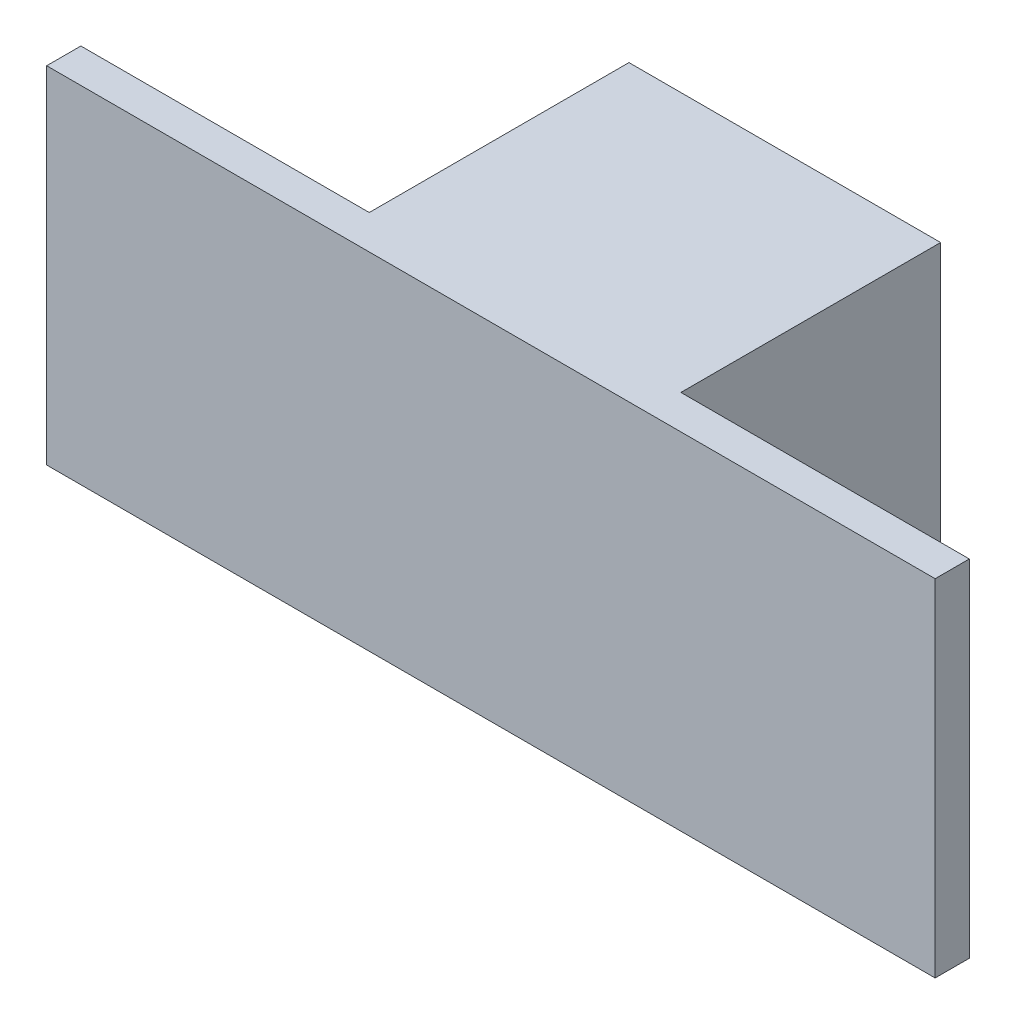
ISO-10303-21;
HEADER;
FILE_DESCRIPTION(('STEP AP214'),'2;1');
FILE_NAME('part.step','',(''),(''),'','','');
FILE_SCHEMA(('AUTOMOTIVE_DESIGN { 1 0 10303 214 1 1 1 1 }'));
ENDSEC;
DATA;
#1=APPLICATION_CONTEXT('core data for automotive mechanical design processes');
#2=APPLICATION_PROTOCOL_DEFINITION('international standard','automotive_design',2000,#1);
#3=PRODUCT_CONTEXT('',#1,'mechanical');
#4=PRODUCT('Part','Part','',(#3));
#5=PRODUCT_RELATED_PRODUCT_CATEGORY('part','',(#4));
#6=PRODUCT_DEFINITION_FORMATION('','',#4);
#7=PRODUCT_DEFINITION_CONTEXT('part definition',#1,'design');
#8=PRODUCT_DEFINITION('design','',#6,#7);
#9=PRODUCT_DEFINITION_SHAPE('','',#8);
#10=(LENGTH_UNIT() NAMED_UNIT(*) SI_UNIT(.MILLI.,.METRE.));
#11=(NAMED_UNIT(*) PLANE_ANGLE_UNIT() SI_UNIT($,.RADIAN.));
#12=(NAMED_UNIT(*) SI_UNIT($,.STERADIAN.) SOLID_ANGLE_UNIT());
#13=UNCERTAINTY_MEASURE_WITH_UNIT(LENGTH_MEASURE(1.E-05),#10,'distance_accuracy_value','');
#14=(GEOMETRIC_REPRESENTATION_CONTEXT(3) GLOBAL_UNCERTAINTY_ASSIGNED_CONTEXT((#13)) GLOBAL_UNIT_ASSIGNED_CONTEXT((#10,
#11,#12)) REPRESENTATION_CONTEXT('',''));
#15=CARTESIAN_POINT('',(0.,0.,0.));
#16=DIRECTION('',(0.,0.,1.));
#17=DIRECTION('',(1.,0.,0.));
#18=AXIS2_PLACEMENT_3D('',#15,#16,#17);
#19=CARTESIAN_POINT('',(2.25036858686379E-13,0.,-5.));
#20=DIRECTION('',(0.,0.,1.));
#21=DIRECTION('',(1.,0.,0.));
#22=AXIS2_PLACEMENT_3D('',#19,#20,#21);
#23=PLANE('',#22);
#24=DIRECTION('',(0.,-1.,0.));
#25=VECTOR('',#24,1.);
#26=CARTESIAN_POINT('',(22.8000000000002,12.,-5.));
#27=LINE('',#26,#25);
#28=CARTESIAN_POINT('',(22.8000000000002,12.,-5.));
#29=VERTEX_POINT('',#28);
#30=CARTESIAN_POINT('',(22.8000000000002,-38.6,-5.));
#31=VERTEX_POINT('',#30);
#32=EDGE_CURVE('E125',#29,#31,#27,.T.);
#33=ORIENTED_EDGE('',*,*,#32,.F.);
#34=DIRECTION('',(1.,0.,0.));
#35=VECTOR('',#34,1.);
#36=CARTESIAN_POINT('',(-64.9999999999998,12.,-5.));
#37=LINE('',#36,#35);
#38=CARTESIAN_POINT('',(65.0000000000002,12.,-5.));
#39=VERTEX_POINT('',#38);
#40=EDGE_CURVE('E109',#29,#39,#37,.T.);
#41=ORIENTED_EDGE('',*,*,#40,.T.);
#42=DIRECTION('',(0.,-1.,0.));
#43=VECTOR('',#42,1.);
#44=CARTESIAN_POINT('',(65.0000000000002,12.,-5.));
#45=LINE('',#44,#43);
#46=CARTESIAN_POINT('',(65.0000000000002,-38.6,-5.));
#47=VERTEX_POINT('',#46);
#48=EDGE_CURVE('E138',#39,#47,#45,.T.);
#49=ORIENTED_EDGE('',*,*,#48,.T.);
#50=DIRECTION('',(-1.,0.,0.));
#51=VECTOR('',#50,1.);
#52=CARTESIAN_POINT('',(-64.9999999999998,-38.6,-5.));
#53=LINE('',#52,#51);
#54=EDGE_CURVE('E11',#47,#31,#53,.T.);
#55=ORIENTED_EDGE('',*,*,#54,.T.);
#56=EDGE_LOOP('',(#33,#41,#49,#55));
#57=FACE_BOUND('',#56,.T.);
#58=ADVANCED_FACE('F41',(#57),#23,.F.);
#59=DIRECTION('',(0.,1.,0.));
#60=VECTOR('',#59,1.);
#61=CARTESIAN_POINT('',(-22.8000000000002,12.,-5.));
#62=LINE('',#61,#60);
#63=CARTESIAN_POINT('',(-22.8000000000002,-38.6,-5.));
#64=VERTEX_POINT('',#63);
#65=CARTESIAN_POINT('',(-22.8000000000002,12.,-5.));
#66=VERTEX_POINT('',#65);
#67=EDGE_CURVE('E56',#64,#66,#62,.T.);
#68=ORIENTED_EDGE('',*,*,#67,.F.);
#69=CARTESIAN_POINT('',(-64.9999999999998,-38.6,-5.));
#70=VERTEX_POINT('',#69);
#71=EDGE_CURVE('E49',#64,#70,#53,.T.);
#72=ORIENTED_EDGE('',*,*,#71,.T.);
#73=DIRECTION('',(0.,1.,0.));
#74=VECTOR('',#73,1.);
#75=CARTESIAN_POINT('',(-64.9999999999998,12.,-5.));
#76=LINE('',#75,#74);
#77=CARTESIAN_POINT('',(-64.9999999999998,12.,-5.));
#78=VERTEX_POINT('',#77);
#79=EDGE_CURVE('E106',#70,#78,#76,.T.);
#80=ORIENTED_EDGE('',*,*,#79,.T.);
#81=EDGE_CURVE('E102',#78,#66,#37,.T.);
#82=ORIENTED_EDGE('',*,*,#81,.T.);
#83=EDGE_LOOP('',(#68,#72,#80,#82));
#84=FACE_BOUND('',#83,.T.);
#85=ADVANCED_FACE('F104',(#84),#23,.F.);
#86=CARTESIAN_POINT('',(-64.9999999999998,12.,-144.500394264676));
#87=DIRECTION('',(-1.,0.,0.));
#88=DIRECTION('',(0.,-1.,0.));
#89=AXIS2_PLACEMENT_3D('',#86,#87,#88);
#90=PLANE('',#89);
#91=ORIENTED_EDGE('',*,*,#79,.F.);
#92=DIRECTION('',(0.,0.,1.));
#93=VECTOR('',#92,1.);
#94=CARTESIAN_POINT('',(-64.9999999999998,-38.6,-144.500394264676));
#95=LINE('',#94,#93);
#96=CARTESIAN_POINT('',(-64.9999999999998,-38.6,0.));
#97=VERTEX_POINT('',#96);
#98=EDGE_CURVE('E155',#70,#97,#95,.T.);
#99=ORIENTED_EDGE('',*,*,#98,.T.);
#100=DIRECTION('',(0.,-1.,0.));
#101=VECTOR('',#100,1.);
#102=CARTESIAN_POINT('',(-64.9999999999998,12.,0.));
#103=LINE('',#102,#101);
#104=CARTESIAN_POINT('',(-64.9999999999998,12.,0.));
#105=VERTEX_POINT('',#104);
#106=EDGE_CURVE('E142',#105,#97,#103,.T.);
#107=ORIENTED_EDGE('',*,*,#106,.F.);
#108=DIRECTION('',(0.,0.,1.));
#109=VECTOR('',#108,1.);
#110=CARTESIAN_POINT('',(-64.9999999999998,12.,-144.500394264676));
#111=LINE('',#110,#109);
#112=EDGE_CURVE('E139',#78,#105,#111,.T.);
#113=ORIENTED_EDGE('',*,*,#112,.F.);
#114=EDGE_LOOP('',(#91,#99,#107,#113));
#115=FACE_BOUND('',#114,.T.);
#116=ADVANCED_FACE('F43',(#115),#90,.T.);
#117=CARTESIAN_POINT('',(-64.9999999999998,12.,-144.500394264676));
#118=DIRECTION('',(0.,1.,0.));
#119=DIRECTION('',(0.,0.,1.));
#120=AXIS2_PLACEMENT_3D('',#117,#118,#119);
#121=PLANE('',#120);
#122=ORIENTED_EDGE('',*,*,#81,.F.);
#123=ORIENTED_EDGE('',*,*,#112,.T.);
#124=DIRECTION('',(-1.,0.,0.));
#125=VECTOR('',#124,1.);
#126=CARTESIAN_POINT('',(-64.9999999999998,12.,0.));
#127=LINE('',#126,#125);
#128=CARTESIAN_POINT('',(65.0000000000002,12.,0.));
#129=VERTEX_POINT('',#128);
#130=EDGE_CURVE('E152',#129,#105,#127,.T.);
#131=ORIENTED_EDGE('',*,*,#130,.F.);
#132=DIRECTION('',(0.,0.,1.));
#133=VECTOR('',#132,1.);
#134=CARTESIAN_POINT('',(65.0000000000002,12.,-144.500394264676));
#135=LINE('',#134,#133);
#136=EDGE_CURVE('E157',#39,#129,#135,.T.);
#137=ORIENTED_EDGE('',*,*,#136,.F.);
#138=ORIENTED_EDGE('',*,*,#40,.F.);
#139=DIRECTION('',(0.,0.,1.));
#140=VECTOR('',#139,1.);
#141=CARTESIAN_POINT('',(22.8000000000002,12.,-111.11549016193));
#142=LINE('',#141,#140);
#143=CARTESIAN_POINT('',(22.8000000000002,12.,-43.));
#144=VERTEX_POINT('',#143);
#145=EDGE_CURVE('E120',#144,#29,#142,.T.);
#146=ORIENTED_EDGE('',*,*,#145,.F.);
#147=DIRECTION('',(-1.,0.,0.));
#148=VECTOR('',#147,1.);
#149=CARTESIAN_POINT('',(22.8000000000002,12.,-43.));
#150=LINE('',#149,#148);
#151=CARTESIAN_POINT('',(-22.8000000000002,12.,-43.));
#152=VERTEX_POINT('',#151);
#153=EDGE_CURVE('E116',#144,#152,#150,.T.);
#154=ORIENTED_EDGE('',*,*,#153,.T.);
#155=DIRECTION('',(0.,0.,1.));
#156=VECTOR('',#155,1.);
#157=CARTESIAN_POINT('',(-22.8000000000002,12.,-111.11549016193));
#158=LINE('',#157,#156);
#159=EDGE_CURVE('E113',#152,#66,#158,.T.);
#160=ORIENTED_EDGE('',*,*,#159,.T.);
#161=EDGE_LOOP('',(#122,#123,#131,#137,#138,#146,#154,#160));
#162=FACE_BOUND('',#161,.T.);
#163=ADVANCED_FACE('F114',(#162),#121,.T.);
#164=CARTESIAN_POINT('',(65.0000000000002,12.,-144.500394264676));
#165=DIRECTION('',(1.,0.,0.));
#166=DIRECTION('',(0.,1.,0.));
#167=AXIS2_PLACEMENT_3D('',#164,#165,#166);
#168=PLANE('',#167);
#169=ORIENTED_EDGE('',*,*,#48,.F.);
#170=ORIENTED_EDGE('',*,*,#136,.T.);
#171=DIRECTION('',(0.,1.,0.));
#172=VECTOR('',#171,1.);
#173=CARTESIAN_POINT('',(65.0000000000002,12.,0.));
#174=LINE('',#173,#172);
#175=CARTESIAN_POINT('',(65.0000000000002,-38.6,0.));
#176=VERTEX_POINT('',#175);
#177=EDGE_CURVE('E149',#176,#129,#174,.T.);
#178=ORIENTED_EDGE('',*,*,#177,.F.);
#179=DIRECTION('',(0.,0.,1.));
#180=VECTOR('',#179,1.);
#181=CARTESIAN_POINT('',(65.0000000000002,-38.6,-144.500394264676));
#182=LINE('',#181,#180);
#183=EDGE_CURVE('E159',#47,#176,#182,.T.);
#184=ORIENTED_EDGE('',*,*,#183,.F.);
#185=EDGE_LOOP('',(#169,#170,#178,#184));
#186=FACE_BOUND('',#185,.T.);
#187=ADVANCED_FACE('F175',(#186),#168,.T.);
#188=CARTESIAN_POINT('',(-64.9999999999998,-38.6,-144.500394264676));
#189=DIRECTION('',(0.,-1.,0.));
#190=DIRECTION('',(0.,0.,-1.));
#191=AXIS2_PLACEMENT_3D('',#188,#189,#190);
#192=PLANE('',#191);
#193=ORIENTED_EDGE('',*,*,#54,.F.);
#194=ORIENTED_EDGE('',*,*,#183,.T.);
#195=DIRECTION('',(1.,0.,0.));
#196=VECTOR('',#195,1.);
#197=CARTESIAN_POINT('',(-64.9999999999998,-38.6,0.));
#198=LINE('',#197,#196);
#199=EDGE_CURVE('E145',#97,#176,#198,.T.);
#200=ORIENTED_EDGE('',*,*,#199,.F.);
#201=ORIENTED_EDGE('',*,*,#98,.F.);
#202=ORIENTED_EDGE('',*,*,#71,.F.);
#203=DIRECTION('',(0.,0.,1.));
#204=VECTOR('',#203,1.);
#205=CARTESIAN_POINT('',(-22.8000000000002,-38.6,-111.11549016193));
#206=LINE('',#205,#204);
#207=CARTESIAN_POINT('',(-22.8000000000002,-38.6,-43.));
#208=VERTEX_POINT('',#207);
#209=EDGE_CURVE('E119',#208,#64,#206,.T.);
#210=ORIENTED_EDGE('',*,*,#209,.F.);
#211=DIRECTION('',(1.,0.,0.));
#212=VECTOR('',#211,1.);
#213=CARTESIAN_POINT('',(22.8000000000002,-38.6,-43.));
#214=LINE('',#213,#212);
#215=CARTESIAN_POINT('',(22.8000000000002,-38.6,-43.));
#216=VERTEX_POINT('',#215);
#217=EDGE_CURVE('E182',#208,#216,#214,.T.);
#218=ORIENTED_EDGE('',*,*,#217,.T.);
#219=DIRECTION('',(0.,0.,1.));
#220=VECTOR('',#219,1.);
#221=CARTESIAN_POINT('',(22.8000000000002,-38.6,-111.11549016193));
#222=LINE('',#221,#220);
#223=EDGE_CURVE('E134',#216,#31,#222,.T.);
#224=ORIENTED_EDGE('',*,*,#223,.T.);
#225=EDGE_LOOP('',(#193,#194,#200,#201,#202,#210,#218,#224));
#226=FACE_BOUND('',#225,.T.);
#227=ADVANCED_FACE('F165',(#226),#192,.T.);
#228=CARTESIAN_POINT('',(0.,0.,0.));
#229=DIRECTION('',(0.,0.,1.));
#230=DIRECTION('',(1.,0.,0.));
#231=AXIS2_PLACEMENT_3D('',#228,#229,#230);
#232=PLANE('',#231);
#233=ORIENTED_EDGE('',*,*,#106,.T.);
#234=ORIENTED_EDGE('',*,*,#199,.T.);
#235=ORIENTED_EDGE('',*,*,#177,.T.);
#236=ORIENTED_EDGE('',*,*,#130,.T.);
#237=EDGE_LOOP('',(#233,#234,#235,#236));
#238=FACE_BOUND('',#237,.T.);
#239=ADVANCED_FACE('F169',(#238),#232,.T.);
#240=CARTESIAN_POINT('',(-22.8000000000002,12.,-111.11549016193));
#241=DIRECTION('',(1.,0.,0.));
#242=DIRECTION('',(0.,1.,0.));
#243=AXIS2_PLACEMENT_3D('',#240,#241,#242);
#244=PLANE('',#243);
#245=ORIENTED_EDGE('',*,*,#159,.F.);
#246=DIRECTION('',(0.,-1.,0.));
#247=VECTOR('',#246,1.);
#248=CARTESIAN_POINT('',(-22.8000000000002,12.,-43.));
#249=LINE('',#248,#247);
#250=EDGE_CURVE('E137',#152,#208,#249,.T.);
#251=ORIENTED_EDGE('',*,*,#250,.T.);
#252=ORIENTED_EDGE('',*,*,#209,.T.);
#253=ORIENTED_EDGE('',*,*,#67,.T.);
#254=EDGE_LOOP('',(#245,#251,#252,#253));
#255=FACE_BOUND('',#254,.T.);
#256=ADVANCED_FACE('F123',(#255),#244,.F.);
#257=CARTESIAN_POINT('',(22.8000000000002,12.,-111.11549016193));
#258=DIRECTION('',(-1.,0.,0.));
#259=DIRECTION('',(0.,0.,1.));
#260=AXIS2_PLACEMENT_3D('',#257,#258,#259);
#261=PLANE('',#260);
#262=ORIENTED_EDGE('',*,*,#223,.F.);
#263=DIRECTION('',(0.,1.,0.));
#264=VECTOR('',#263,1.);
#265=CARTESIAN_POINT('',(22.8000000000002,12.,-43.));
#266=LINE('',#265,#264);
#267=EDGE_CURVE('E146',#216,#144,#266,.T.);
#268=ORIENTED_EDGE('',*,*,#267,.T.);
#269=ORIENTED_EDGE('',*,*,#145,.T.);
#270=ORIENTED_EDGE('',*,*,#32,.T.);
#271=EDGE_LOOP('',(#262,#268,#269,#270));
#272=FACE_BOUND('',#271,.T.);
#273=ADVANCED_FACE('F178',(#272),#261,.F.);
#274=CARTESIAN_POINT('',(22.8000000000002,-38.6,-43.));
#275=DIRECTION('',(0.,0.,1.));
#276=DIRECTION('',(-1.,0.,0.));
#277=AXIS2_PLACEMENT_3D('',#274,#275,#276);
#278=PLANE('',#277);
#279=ORIENTED_EDGE('',*,*,#217,.F.);
#280=ORIENTED_EDGE('',*,*,#250,.F.);
#281=ORIENTED_EDGE('',*,*,#153,.F.);
#282=ORIENTED_EDGE('',*,*,#267,.F.);
#283=EDGE_LOOP('',(#279,#280,#281,#282));
#284=FACE_BOUND('',#283,.T.);
#285=ADVANCED_FACE('F185',(#284),#278,.F.);
#286=CLOSED_SHELL('',(#58,#85,#116,#163,#187,#227,#239,#256,#273,#285));
#287=MANIFOLD_SOLID_BREP('B2',#286);
#288=ADVANCED_BREP_SHAPE_REPRESENTATION('',(#18,#287),#14);
#289=SHAPE_DEFINITION_REPRESENTATION(#9,#288);
ENDSEC;
END-ISO-10303-21;
